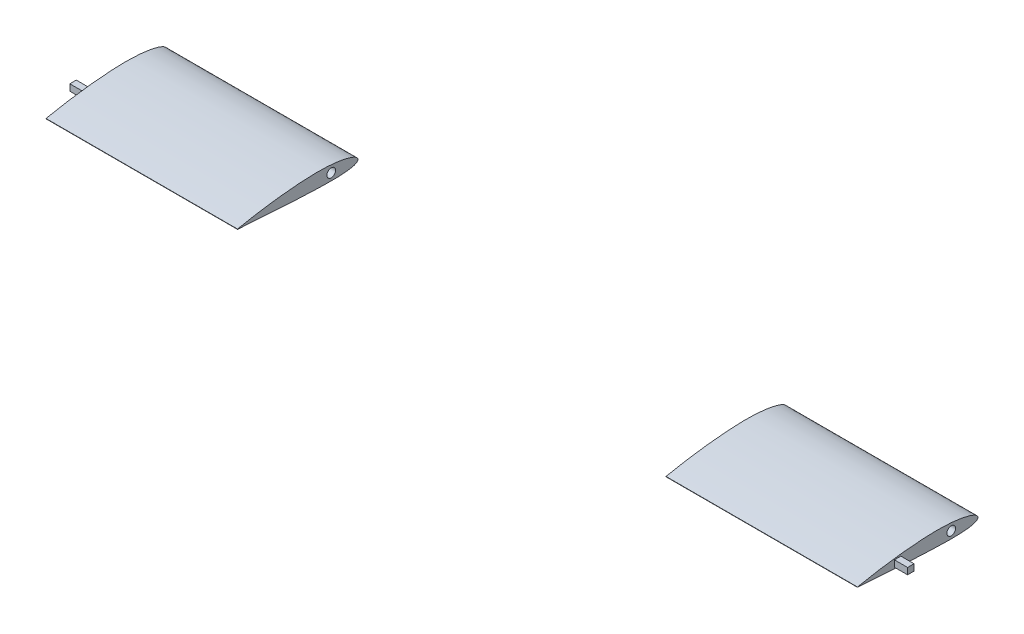
ISO-10303-21;
HEADER;
FILE_DESCRIPTION(('STEP AP214'),'2;1');
FILE_NAME('part.step','',(''),(''),'','','');
FILE_SCHEMA(('AUTOMOTIVE_DESIGN { 1 0 10303 214 1 1 1 1 }'));
ENDSEC;
DATA;
#1=APPLICATION_CONTEXT('core data for automotive mechanical design processes');
#2=APPLICATION_PROTOCOL_DEFINITION('international standard','automotive_design',2000,#1);
#3=PRODUCT_CONTEXT('',#1,'mechanical');
#4=PRODUCT('Part','Part','',(#3));
#5=PRODUCT_RELATED_PRODUCT_CATEGORY('part','',(#4));
#6=PRODUCT_DEFINITION_FORMATION('','',#4);
#7=PRODUCT_DEFINITION_CONTEXT('part definition',#1,'design');
#8=PRODUCT_DEFINITION('design','',#6,#7);
#9=PRODUCT_DEFINITION_SHAPE('','',#8);
#10=(LENGTH_UNIT() NAMED_UNIT(*) SI_UNIT(.MILLI.,.METRE.));
#11=(NAMED_UNIT(*) PLANE_ANGLE_UNIT() SI_UNIT($,.RADIAN.));
#12=(NAMED_UNIT(*) SI_UNIT($,.STERADIAN.) SOLID_ANGLE_UNIT());
#13=UNCERTAINTY_MEASURE_WITH_UNIT(LENGTH_MEASURE(1.E-05),#10,'distance_accuracy_value','');
#14=(GEOMETRIC_REPRESENTATION_CONTEXT(3) GLOBAL_UNCERTAINTY_ASSIGNED_CONTEXT((#13)) GLOBAL_UNIT_ASSIGNED_CONTEXT((#10,
#11,#12)) REPRESENTATION_CONTEXT('',''));
#15=CARTESIAN_POINT('',(0.,0.,0.));
#16=DIRECTION('',(0.,0.,1.));
#17=DIRECTION('',(1.,0.,0.));
#18=AXIS2_PLACEMENT_3D('',#15,#16,#17);
#19=CARTESIAN_POINT('',(383.,21.9066393458341,0.0898082584499967));
#20=DIRECTION('',(-1.,0.,0.));
#21=DIRECTION('',(0.,0.,-1.));
#22=AXIS2_PLACEMENT_3D('',#19,#20,#21);
#23=PLANE('',#22);
#24=CARTESIAN_POINT('',(383.,21.4323662432829,90.));
#25=CARTESIAN_POINT('',(383.,21.7395453735164,88.5009339259648));
#26=CARTESIAN_POINT('',(383.,22.3530968521773,85.5067389569377));
#27=CARTESIAN_POINT('',(383.,23.4769009739327,79.5132070250295));
#28=CARTESIAN_POINT('',(383.,24.7220768679953,72.0172549020665));
#29=CARTESIAN_POINT('',(383.,26.0108035511243,63.0161594976841));
#30=CARTESIAN_POINT('',(383.,27.0855539847585,54.0165489010127));
#31=CARTESIAN_POINT('',(383.,27.8725023386409,45.0130366232361));
#32=CARTESIAN_POINT('',(383.,28.4054210980569,36.0115747531414));
#33=CARTESIAN_POINT('',(383.,28.4956283216556,28.5013825090026));
#34=CARTESIAN_POINT('',(383.,28.2471424177953,22.4991480564598));
#35=CARTESIAN_POINT('',(383.,27.8830387632402,17.9937913398135));
#36=CARTESIAN_POINT('',(383.,27.3064569381922,13.4827466610456));
#37=CARTESIAN_POINT('',(383.,26.5964410206564,9.7284358411352));
#38=CARTESIAN_POINT('',(383.,25.7931618084987,6.73542557773655));
#39=CARTESIAN_POINT('',(383.,25.0628621788086,4.46630110284185));
#40=CARTESIAN_POINT('',(383.,24.2119534219819,2.543789770691));
#41=CARTESIAN_POINT('',(383.,23.1803206796216,0.88544887639786));
#42=CARTESIAN_POINT('',(383.,21.3962581054763,-0.560680660518415));
#43=CARTESIAN_POINT('',(383.,19.828099306194,0.941462623926129));
#44=CARTESIAN_POINT('',(383.,19.1128759355664,2.56878461221583));
#45=CARTESIAN_POINT('',(383.,18.5695879239883,4.48283790204994));
#46=CARTESIAN_POINT('',(383.,18.1800489520533,6.74449178966805));
#47=CARTESIAN_POINT('',(383.,17.8476208307239,9.74948066666687));
#48=CARTESIAN_POINT('',(383.,17.591755210336,13.5004363160743));
#49=CARTESIAN_POINT('',(383.,17.4891711460737,18.0043672362339));
#50=CARTESIAN_POINT('',(383.,17.503466580105,22.5050836996857));
#51=CARTESIAN_POINT('',(383.,17.6359103895328,28.5052315345405));
#52=CARTESIAN_POINT('',(383.,17.8742353776701,36.0061164796125));
#53=CARTESIAN_POINT('',(383.,18.2889930821133,45.0060655157111));
#54=CARTESIAN_POINT('',(383.,18.8280750549617,54.0034048422384));
#55=CARTESIAN_POINT('',(383.,19.3884076073586,63.002270200824));
#56=CARTESIAN_POINT('',(383.,19.9555851579576,72.0026742101379));
#57=CARTESIAN_POINT('',(383.,20.4779531958413,79.5005431049559));
#58=CARTESIAN_POINT('',(383.,20.88086522472,85.5006876811084));
#59=CARTESIAN_POINT('',(383.,21.0925383354339,88.5001605661209));
#60=CARTESIAN_POINT('',(383.,21.1983821589026,90.));
#61=B_SPLINE_CURVE_WITH_KNOTS('',3,(#24,#25,#26,#27,#28,#29,#30,#31,#32,#33,#34,#35,#36,#37,#38,
#39,#40,#41,#42,#43,#44,#45,#46,#47,#48,#49,#50,#51,#52,#53,#54,#55,#56,#57,#58,#59,#60),
.UNSPECIFIED.,.F.,.F.,(4,1,1,1,1,1,1,1,1,1,1,1,1,1,1,1,1,1,1,1,1,1,1,1,1,1,1,1,1,1,1,1,1,1,4),
(0.,0.0250124897498648,0.0499592861642578,0.0996729249269686,0.149206319909966,
0.198581096615965,0.247805170456833,0.296916574601493,0.345952721793533,0.370491625569911,
0.395091203654929,0.41981479582396,0.444798575016595,0.457489818915221,0.47040640543549,
0.483879408669829,0.491264120322896,0.503458853294665,0.513609129403887,0.520450990700287,
0.533235387615153,0.545691039147803,0.558031884237173,0.582609167247894,0.607134741746914,
0.631652079836766,0.656174271859652,0.705233949250519,0.754320378530032,0.803437363555032,
0.852566095729537,0.901700994033255,0.950848809337271,0.975422716989279,1.),.UNSPECIFIED.);
#62=CARTESIAN_POINT('',(383.,21.4323662432829,90.));
#63=VERTEX_POINT('',#62);
#64=CARTESIAN_POINT('',(383.,21.1983821589026,90.));
#65=VERTEX_POINT('',#64);
#66=EDGE_CURVE('E193',#63,#65,#61,.T.);
#67=ORIENTED_EDGE('',*,*,#66,.F.);
#68=DIRECTION('',(0.,1.,0.));
#69=VECTOR('',#68,1.);
#70=CARTESIAN_POINT('',(383.,21.4323662432829,90.));
#71=LINE('',#70,#69);
#72=EDGE_CURVE('E199',#65,#63,#71,.T.);
#73=ORIENTED_EDGE('',*,*,#72,.F.);
#74=EDGE_LOOP('',(#67,#73));
#75=FACE_BOUND('',#74,.T.);
#76=CARTESIAN_POINT('',(383.,22.7683278000442,20.));
#77=DIRECTION('',(1.,0.,0.));
#78=DIRECTION('',(0.,0.,-1.));
#79=AXIS2_PLACEMENT_3D('',#76,#77,#78);
#80=CIRCLE('',#79,3.25);
#81=CARTESIAN_POINT('',(383.,22.7683278000442,16.75));
#82=VERTEX_POINT('',#81);
#83=EDGE_CURVE('E160',#82,#82,#80,.T.);
#84=ORIENTED_EDGE('',*,*,#83,.F.);
#85=EDGE_LOOP('',(#84));
#86=FACE_BOUND('',#85,.T.);
#87=DIRECTION('',(0.,-1.,0.));
#88=VECTOR('',#87,1.);
#89=CARTESIAN_POINT('',(383.,20.3683278000442,57.6));
#90=LINE('',#89,#88);
#91=CARTESIAN_POINT('',(383.,25.1683278000442,57.6));
#92=VERTEX_POINT('',#91);
#93=CARTESIAN_POINT('',(383.,20.3683278000442,57.6));
#94=VERTEX_POINT('',#93);
#95=EDGE_CURVE('E151',#92,#94,#90,.T.);
#96=ORIENTED_EDGE('',*,*,#95,.T.);
#97=DIRECTION('',(0.,0.,1.));
#98=VECTOR('',#97,1.);
#99=CARTESIAN_POINT('',(383.,20.3683278000442,62.4));
#100=LINE('',#99,#98);
#101=CARTESIAN_POINT('',(383.,20.3683278000442,62.4));
#102=VERTEX_POINT('',#101);
#103=EDGE_CURVE('E137',#94,#102,#100,.T.);
#104=ORIENTED_EDGE('',*,*,#103,.T.);
#105=DIRECTION('',(0.,1.,0.));
#106=VECTOR('',#105,1.);
#107=CARTESIAN_POINT('',(383.,25.1683278000442,62.4));
#108=LINE('',#107,#106);
#109=CARTESIAN_POINT('',(383.,25.1683278000442,62.4));
#110=VERTEX_POINT('',#109);
#111=EDGE_CURVE('E145',#102,#110,#108,.T.);
#112=ORIENTED_EDGE('',*,*,#111,.T.);
#113=DIRECTION('',(0.,0.,-1.));
#114=VECTOR('',#113,1.);
#115=CARTESIAN_POINT('',(383.,25.1683278000442,57.6));
#116=LINE('',#115,#114);
#117=EDGE_CURVE('E142',#110,#92,#116,.T.);
#118=ORIENTED_EDGE('',*,*,#117,.T.);
#119=EDGE_LOOP('',(#96,#104,#112,#118));
#120=FACE_BOUND('',#119,.T.);
#121=ADVANCED_FACE('F73',(#75,#86,#120),#23,.F.);
#122=CARTESIAN_POINT('',(160.,0.,90.));
#123=DIRECTION('',(0.,0.,1.));
#124=DIRECTION('',(-1.,0.,0.));
#125=AXIS2_PLACEMENT_3D('',#122,#123,#124);
#126=PLANE('',#125);
#127=DIRECTION('',(0.,-1.,0.));
#128=VECTOR('',#127,1.);
#129=CARTESIAN_POINT('',(240.,0.,90.));
#130=LINE('',#129,#128);
#131=CARTESIAN_POINT('',(240.,21.4323662432829,90.));
#132=VERTEX_POINT('',#131);
#133=CARTESIAN_POINT('',(240.,21.1983821589026,90.));
#134=VERTEX_POINT('',#133);
#135=EDGE_CURVE('E163',#132,#134,#130,.T.);
#136=ORIENTED_EDGE('',*,*,#135,.T.);
#137=DIRECTION('',(-1.,0.,0.));
#138=VECTOR('',#137,1.);
#139=CARTESIAN_POINT('',(383.,21.1983821589026,90.));
#140=LINE('',#139,#138);
#141=EDGE_CURVE('E82',#65,#134,#140,.T.);
#142=ORIENTED_EDGE('',*,*,#141,.F.);
#143=ORIENTED_EDGE('',*,*,#72,.T.);
#144=DIRECTION('',(-1.,0.,0.));
#145=VECTOR('',#144,1.);
#146=CARTESIAN_POINT('',(383.,21.4323662432829,90.));
#147=LINE('',#146,#145);
#148=EDGE_CURVE('E206',#63,#132,#147,.T.);
#149=ORIENTED_EDGE('',*,*,#148,.T.);
#150=EDGE_LOOP('',(#136,#142,#143,#149));
#151=FACE_BOUND('',#150,.T.);
#152=ADVANCED_FACE('F75',(#151),#126,.T.);
#153=DIRECTION('',(-1.,0.,0.));
#154=VECTOR('',#153,1.);
#155=SURFACE_OF_LINEAR_EXTRUSION('',#61,#154);
#156=CARTESIAN_POINT('',(240.,21.1983821589026,90.));
#157=CARTESIAN_POINT('',(240.,21.0925383354339,88.5001605661209));
#158=CARTESIAN_POINT('',(240.,20.88086522472,85.5006876811084));
#159=CARTESIAN_POINT('',(240.,20.4779531958413,79.5005431049559));
#160=CARTESIAN_POINT('',(240.,19.9555851579576,72.0026742101379));
#161=CARTESIAN_POINT('',(240.,19.3884076073586,63.002270200824));
#162=CARTESIAN_POINT('',(240.,18.8280750549617,54.0034048422384));
#163=CARTESIAN_POINT('',(240.,18.2889930821133,45.0060655157111));
#164=CARTESIAN_POINT('',(240.,17.8742353776701,36.0061164796125));
#165=CARTESIAN_POINT('',(240.,17.6359103895328,28.5052315345405));
#166=CARTESIAN_POINT('',(240.,17.503466580105,22.5050836996857));
#167=CARTESIAN_POINT('',(240.,17.4891711460737,18.0043672362339));
#168=CARTESIAN_POINT('',(240.,17.591755210336,13.5004363160743));
#169=CARTESIAN_POINT('',(240.,17.8476208307239,9.74948066666687));
#170=CARTESIAN_POINT('',(240.,18.1800489520533,6.74449178966805));
#171=CARTESIAN_POINT('',(240.,18.5695879239883,4.48283790204994));
#172=CARTESIAN_POINT('',(240.,19.1128759355664,2.56878461221583));
#173=CARTESIAN_POINT('',(240.,19.828099306194,0.941462623926129));
#174=CARTESIAN_POINT('',(240.,21.3962581054763,-0.560680660518415));
#175=CARTESIAN_POINT('',(240.,23.1803206796216,0.88544887639786));
#176=CARTESIAN_POINT('',(240.,24.2119534219819,2.543789770691));
#177=CARTESIAN_POINT('',(240.,25.0628621788086,4.46630110284185));
#178=CARTESIAN_POINT('',(240.,25.7931618084987,6.73542557773655));
#179=CARTESIAN_POINT('',(240.,26.5964410206564,9.7284358411352));
#180=CARTESIAN_POINT('',(240.,27.3064569381922,13.4827466610456));
#181=CARTESIAN_POINT('',(240.,27.8830387632402,17.9937913398135));
#182=CARTESIAN_POINT('',(240.,28.2471424177953,22.4991480564598));
#183=CARTESIAN_POINT('',(240.,28.4956283216556,28.5013825090026));
#184=CARTESIAN_POINT('',(240.,28.4054210980569,36.0115747531414));
#185=CARTESIAN_POINT('',(240.,27.8725023386409,45.0130366232361));
#186=CARTESIAN_POINT('',(240.,27.0855539847585,54.0165489010127));
#187=CARTESIAN_POINT('',(240.,26.0108035511243,63.0161594976841));
#188=CARTESIAN_POINT('',(240.,24.7220768679953,72.0172549020665));
#189=CARTESIAN_POINT('',(240.,23.4769009739327,79.5132070250295));
#190=CARTESIAN_POINT('',(240.,22.3530968521773,85.5067389569377));
#191=CARTESIAN_POINT('',(240.,21.7395453735164,88.5009339259648));
#192=CARTESIAN_POINT('',(240.,21.4323662432829,90.));
#193=B_SPLINE_CURVE_WITH_KNOTS('',3,(#156,#157,#158,#159,#160,#161,#162,#163,#164,#165,#166,
#167,#168,#169,#170,#171,#172,#173,#174,#175,#176,#177,#178,#179,#180,#181,#182,#183,#184,#185,
#186,#187,#188,#189,#190,#191,#192),.UNSPECIFIED.,.F.,.F.,(4,1,1,1,1,1,1,1,1,1,1,1,1,1,1,1,1,1,
1,1,1,1,1,1,1,1,1,1,1,1,1,1,1,1,4),(0.,0.0245772830107215,0.0491511906627294,0.0982990059667455,
0.147433904270463,0.196562636444968,0.245679621469968,0.294766050749481,0.343825728140348,
0.368347920163234,0.392865258253086,0.417390832752106,0.441968115762827,0.454308960852197,
0.466764612384847,0.479549009299713,0.486390870596113,0.496541146705335,0.508735879677104,
0.516120591330171,0.52959359456451,0.542510181084779,0.555201424983405,0.58018520417604,
0.604908796345071,0.629508374430089,0.654047278206467,0.703083425398507,0.752194829543167,
0.801418903384035,0.850793680090034,0.900327075073031,0.950040713835742,0.974987510250135,1.),.UNSPECIFIED.);
#194=EDGE_CURVE('E13',#134,#132,#193,.T.);
#195=ORIENTED_EDGE('',*,*,#194,.T.);
#196=ORIENTED_EDGE('',*,*,#148,.F.);
#197=ORIENTED_EDGE('',*,*,#66,.T.);
#198=ORIENTED_EDGE('',*,*,#141,.T.);
#199=EDGE_LOOP('',(#195,#196,#197,#198));
#200=FACE_BOUND('',#199,.T.);
#201=ADVANCED_FACE('F184',(#200),#155,.T.);
#202=CARTESIAN_POINT('',(240.,0.,0.));
#203=DIRECTION('',(1.,0.,0.));
#204=DIRECTION('',(0.,0.,1.));
#205=AXIS2_PLACEMENT_3D('',#202,#203,#204);
#206=PLANE('',#205);
#207=CARTESIAN_POINT('',(240.,22.7683278000442,20.));
#208=DIRECTION('',(-1.,0.,0.));
#209=DIRECTION('',(0.,0.,1.));
#210=AXIS2_PLACEMENT_3D('',#207,#208,#209);
#211=CIRCLE('',#210,3.25);
#212=CARTESIAN_POINT('',(240.,22.7683278000442,23.25));
#213=VERTEX_POINT('',#212);
#214=EDGE_CURVE('E77',#213,#213,#211,.T.);
#215=ORIENTED_EDGE('',*,*,#214,.F.);
#216=EDGE_LOOP('',(#215));
#217=FACE_BOUND('',#216,.T.);
#218=ORIENTED_EDGE('',*,*,#135,.F.);
#219=ORIENTED_EDGE('',*,*,#194,.F.);
#220=EDGE_LOOP('',(#218,#219));
#221=FACE_BOUND('',#220,.T.);
#222=ADVANCED_FACE('F173',(#217,#221),#206,.F.);
#223=CARTESIAN_POINT('',(239.974958566065,22.7683278000442,20.));
#224=DIRECTION('',(1.,0.,0.));
#225=DIRECTION('',(0.,0.,1.));
#226=AXIS2_PLACEMENT_3D('',#223,#224,#225);
#227=CYLINDRICAL_SURFACE('',#226,3.25);
#228=ORIENTED_EDGE('',*,*,#214,.T.);
#229=EDGE_LOOP('',(#228));
#230=FACE_BOUND('',#229,.T.);
#231=ORIENTED_EDGE('',*,*,#83,.T.);
#232=EDGE_LOOP('',(#231));
#233=FACE_BOUND('',#232,.T.);
#234=ADVANCED_FACE('F183',(#230,#233),#227,.F.);
#235=CARTESIAN_POINT('',(392.8,20.3683278000442,57.6));
#236=DIRECTION('',(0.,0.,1.));
#237=DIRECTION('',(-1.,0.,0.));
#238=AXIS2_PLACEMENT_3D('',#235,#236,#237);
#239=PLANE('',#238);
#240=ORIENTED_EDGE('',*,*,#95,.F.);
#241=DIRECTION('',(-1.,0.,0.));
#242=VECTOR('',#241,1.);
#243=CARTESIAN_POINT('',(392.8,25.1683278000442,57.6));
#244=LINE('',#243,#242);
#245=CARTESIAN_POINT('',(392.8,25.1683278000442,57.6));
#246=VERTEX_POINT('',#245);
#247=EDGE_CURVE('E141',#246,#92,#244,.T.);
#248=ORIENTED_EDGE('',*,*,#247,.F.);
#249=DIRECTION('',(0.,-1.,0.));
#250=VECTOR('',#249,1.);
#251=CARTESIAN_POINT('',(392.8,20.3683278000442,57.6));
#252=LINE('',#251,#250);
#253=CARTESIAN_POINT('',(392.8,20.3683278000442,57.6));
#254=VERTEX_POINT('',#253);
#255=EDGE_CURVE('E130',#246,#254,#252,.T.);
#256=ORIENTED_EDGE('',*,*,#255,.T.);
#257=DIRECTION('',(-1.,0.,0.));
#258=VECTOR('',#257,1.);
#259=CARTESIAN_POINT('',(392.8,20.3683278000442,57.6));
#260=LINE('',#259,#258);
#261=EDGE_CURVE('E89',#254,#94,#260,.T.);
#262=ORIENTED_EDGE('',*,*,#261,.T.);
#263=EDGE_LOOP('',(#240,#248,#256,#262));
#264=FACE_BOUND('',#263,.T.);
#265=ADVANCED_FACE('F140',(#264),#239,.F.);
#266=CARTESIAN_POINT('',(392.8,20.3683278000442,62.4));
#267=DIRECTION('',(0.,1.,0.));
#268=DIRECTION('',(0.,0.,1.));
#269=AXIS2_PLACEMENT_3D('',#266,#267,#268);
#270=PLANE('',#269);
#271=ORIENTED_EDGE('',*,*,#103,.F.);
#272=ORIENTED_EDGE('',*,*,#261,.F.);
#273=DIRECTION('',(0.,0.,1.));
#274=VECTOR('',#273,1.);
#275=CARTESIAN_POINT('',(392.8,20.3683278000442,62.4));
#276=LINE('',#275,#274);
#277=CARTESIAN_POINT('',(392.8,20.3683278000442,62.4));
#278=VERTEX_POINT('',#277);
#279=EDGE_CURVE('E128',#254,#278,#276,.T.);
#280=ORIENTED_EDGE('',*,*,#279,.T.);
#281=DIRECTION('',(-1.,0.,0.));
#282=VECTOR('',#281,1.);
#283=CARTESIAN_POINT('',(392.8,20.3683278000442,62.4));
#284=LINE('',#283,#282);
#285=EDGE_CURVE('E96',#278,#102,#284,.T.);
#286=ORIENTED_EDGE('',*,*,#285,.T.);
#287=EDGE_LOOP('',(#271,#272,#280,#286));
#288=FACE_BOUND('',#287,.T.);
#289=ADVANCED_FACE('F135',(#288),#270,.F.);
#290=CARTESIAN_POINT('',(392.8,25.1683278000442,62.4));
#291=DIRECTION('',(0.,0.,-1.));
#292=DIRECTION('',(1.,0.,0.));
#293=AXIS2_PLACEMENT_3D('',#290,#291,#292);
#294=PLANE('',#293);
#295=ORIENTED_EDGE('',*,*,#111,.F.);
#296=ORIENTED_EDGE('',*,*,#285,.F.);
#297=DIRECTION('',(0.,1.,0.));
#298=VECTOR('',#297,1.);
#299=CARTESIAN_POINT('',(392.8,25.1683278000442,62.4));
#300=LINE('',#299,#298);
#301=CARTESIAN_POINT('',(392.8,25.1683278000442,62.4));
#302=VERTEX_POINT('',#301);
#303=EDGE_CURVE('E133',#278,#302,#300,.T.);
#304=ORIENTED_EDGE('',*,*,#303,.T.);
#305=DIRECTION('',(-1.,0.,0.));
#306=VECTOR('',#305,1.);
#307=CARTESIAN_POINT('',(392.8,25.1683278000442,62.4));
#308=LINE('',#307,#306);
#309=EDGE_CURVE('E157',#302,#110,#308,.T.);
#310=ORIENTED_EDGE('',*,*,#309,.T.);
#311=EDGE_LOOP('',(#295,#296,#304,#310));
#312=FACE_BOUND('',#311,.T.);
#313=ADVANCED_FACE('F233',(#312),#294,.F.);
#314=CARTESIAN_POINT('',(392.8,25.1683278000442,57.6));
#315=DIRECTION('',(0.,-1.,0.));
#316=DIRECTION('',(0.,0.,-1.));
#317=AXIS2_PLACEMENT_3D('',#314,#315,#316);
#318=PLANE('',#317);
#319=ORIENTED_EDGE('',*,*,#117,.F.);
#320=ORIENTED_EDGE('',*,*,#309,.F.);
#321=DIRECTION('',(0.,0.,-1.));
#322=VECTOR('',#321,1.);
#323=CARTESIAN_POINT('',(392.8,25.1683278000442,57.6));
#324=LINE('',#323,#322);
#325=EDGE_CURVE('E149',#302,#246,#324,.T.);
#326=ORIENTED_EDGE('',*,*,#325,.T.);
#327=ORIENTED_EDGE('',*,*,#247,.T.);
#328=EDGE_LOOP('',(#319,#320,#326,#327));
#329=FACE_BOUND('',#328,.T.);
#330=ADVANCED_FACE('F231',(#329),#318,.F.);
#331=CARTESIAN_POINT('',(392.8,0.,0.));
#332=DIRECTION('',(-1.,0.,0.));
#333=DIRECTION('',(0.,0.,-1.));
#334=AXIS2_PLACEMENT_3D('',#331,#332,#333);
#335=PLANE('',#334);
#336=ORIENTED_EDGE('',*,*,#255,.F.);
#337=ORIENTED_EDGE('',*,*,#325,.F.);
#338=ORIENTED_EDGE('',*,*,#303,.F.);
#339=ORIENTED_EDGE('',*,*,#279,.F.);
#340=EDGE_LOOP('',(#336,#337,#338,#339));
#341=FACE_BOUND('',#340,.T.);
#342=ADVANCED_FACE('F129',(#341),#335,.F.);
#343=CLOSED_SHELL('',(#121,#152,#201,#222,#234,#265,#289,#313,#330,#342));
#344=MANIFOLD_SOLID_BREP('B2',#343);
#345=CARTESIAN_POINT('',(-223.,21.9066393458341,0.0898082584499967));
#346=DIRECTION('',(1.,0.,0.));
#347=DIRECTION('',(0.,0.,-1.));
#348=AXIS2_PLACEMENT_3D('',#345,#346,#347);
#349=PLANE('',#348);
#350=CARTESIAN_POINT('',(-223.,21.4323662432829,90.));
#351=CARTESIAN_POINT('',(-223.,21.7395453735164,88.5009339259648));
#352=CARTESIAN_POINT('',(-223.,22.3530968521773,85.5067389569377));
#353=CARTESIAN_POINT('',(-223.,23.4769009739327,79.5132070250295));
#354=CARTESIAN_POINT('',(-223.,24.7220768679953,72.0172549020665));
#355=CARTESIAN_POINT('',(-223.,26.0108035511243,63.0161594976841));
#356=CARTESIAN_POINT('',(-223.,27.0855539847585,54.0165489010127));
#357=CARTESIAN_POINT('',(-223.,27.8725023386409,45.0130366232361));
#358=CARTESIAN_POINT('',(-223.,28.4054210980569,36.0115747531414));
#359=CARTESIAN_POINT('',(-223.,28.4956283216556,28.5013825090026));
#360=CARTESIAN_POINT('',(-223.,28.2471424177953,22.4991480564598));
#361=CARTESIAN_POINT('',(-223.,27.8830387632402,17.9937913398135));
#362=CARTESIAN_POINT('',(-223.,27.3064569381922,13.4827466610456));
#363=CARTESIAN_POINT('',(-223.,26.5964410206564,9.7284358411352));
#364=CARTESIAN_POINT('',(-223.,25.7931618084987,6.73542557773655));
#365=CARTESIAN_POINT('',(-223.,25.0628621788086,4.46630110284185));
#366=CARTESIAN_POINT('',(-223.,24.2119534219819,2.543789770691));
#367=CARTESIAN_POINT('',(-223.,23.1803206796216,0.88544887639786));
#368=CARTESIAN_POINT('',(-223.,21.3962581054763,-0.560680660518415));
#369=CARTESIAN_POINT('',(-223.,19.828099306194,0.941462623926129));
#370=CARTESIAN_POINT('',(-223.,19.1128759355664,2.56878461221583));
#371=CARTESIAN_POINT('',(-223.,18.5695879239883,4.48283790204994));
#372=CARTESIAN_POINT('',(-223.,18.1800489520533,6.74449178966805));
#373=CARTESIAN_POINT('',(-223.,17.8476208307239,9.74948066666687));
#374=CARTESIAN_POINT('',(-223.,17.591755210336,13.5004363160743));
#375=CARTESIAN_POINT('',(-223.,17.4891711460737,18.0043672362339));
#376=CARTESIAN_POINT('',(-223.,17.503466580105,22.5050836996857));
#377=CARTESIAN_POINT('',(-223.,17.6359103895328,28.5052315345405));
#378=CARTESIAN_POINT('',(-223.,17.8742353776701,36.0061164796125));
#379=CARTESIAN_POINT('',(-223.,18.2889930821133,45.0060655157111));
#380=CARTESIAN_POINT('',(-223.,18.8280750549617,54.0034048422384));
#381=CARTESIAN_POINT('',(-223.,19.3884076073586,63.002270200824));
#382=CARTESIAN_POINT('',(-223.,19.9555851579576,72.0026742101379));
#383=CARTESIAN_POINT('',(-223.,20.4779531958413,79.5005431049559));
#384=CARTESIAN_POINT('',(-223.,20.88086522472,85.5006876811084));
#385=CARTESIAN_POINT('',(-223.,21.0925383354339,88.5001605661209));
#386=CARTESIAN_POINT('',(-223.,21.1983821589026,90.));
#387=B_SPLINE_CURVE_WITH_KNOTS('',3,(#350,#351,#352,#353,#354,#355,#356,#357,#358,#359,#360,
#361,#362,#363,#364,#365,#366,#367,#368,#369,#370,#371,#372,#373,#374,#375,#376,#377,#378,#379,
#380,#381,#382,#383,#384,#385,#386),.UNSPECIFIED.,.F.,.F.,(4,1,1,1,1,1,1,1,1,1,1,1,1,1,1,1,1,1,
1,1,1,1,1,1,1,1,1,1,1,1,1,1,1,1,4),(0.,0.0250124897498648,0.0499592861642578,0.0996729249269686,
0.149206319909966,0.198581096615965,0.247805170456833,0.296916574601493,0.345952721793533,
0.370491625569911,0.395091203654929,0.41981479582396,0.444798575016595,0.457489818915221,
0.47040640543549,0.483879408669829,0.491264120322896,0.503458853294665,0.513609129403887,
0.520450990700287,0.533235387615153,0.545691039147803,0.558031884237173,0.582609167247894,
0.607134741746914,0.631652079836766,0.656174271859652,0.705233949250519,0.754320378530032,
0.803437363555032,0.852566095729537,0.901700994033255,0.950848809337271,0.975422716989279,1.),.UNSPECIFIED.);
#388=CARTESIAN_POINT('',(-223.,21.4323662432829,90.));
#389=VERTEX_POINT('',#388);
#390=CARTESIAN_POINT('',(-223.,21.1983821589026,90.));
#391=VERTEX_POINT('',#390);
#392=EDGE_CURVE('E452',#389,#391,#387,.T.);
#393=ORIENTED_EDGE('',*,*,#392,.T.);
#394=DIRECTION('',(0.,1.,0.));
#395=VECTOR('',#394,1.);
#396=CARTESIAN_POINT('',(-223.,21.4323662432829,90.));
#397=LINE('',#396,#395);
#398=EDGE_CURVE('E458',#391,#389,#397,.T.);
#399=ORIENTED_EDGE('',*,*,#398,.T.);
#400=EDGE_LOOP('',(#393,#399));
#401=FACE_BOUND('',#400,.T.);
#402=CARTESIAN_POINT('',(-223.,22.7683278000442,20.));
#403=DIRECTION('',(1.,0.,0.));
#404=DIRECTION('',(0.,0.,-1.));
#405=AXIS2_PLACEMENT_3D('',#402,#403,#404);
#406=CIRCLE('',#405,3.25);
#407=CARTESIAN_POINT('',(-223.,22.7683278000442,16.75));
#408=VERTEX_POINT('',#407);
#409=EDGE_CURVE('E414',#408,#408,#406,.T.);
#410=ORIENTED_EDGE('',*,*,#409,.T.);
#411=EDGE_LOOP('',(#410));
#412=FACE_BOUND('',#411,.T.);
#413=DIRECTION('',(0.,-1.,0.));
#414=VECTOR('',#413,1.);
#415=CARTESIAN_POINT('',(-223.,20.3683278000442,57.6));
#416=LINE('',#415,#414);
#417=CARTESIAN_POINT('',(-223.,25.1683278000442,57.6));
#418=VERTEX_POINT('',#417);
#419=CARTESIAN_POINT('',(-223.,20.3683278000442,57.6));
#420=VERTEX_POINT('',#419);
#421=EDGE_CURVE('E411',#418,#420,#416,.T.);
#422=ORIENTED_EDGE('',*,*,#421,.F.);
#423=DIRECTION('',(0.,0.,-1.));
#424=VECTOR('',#423,1.);
#425=CARTESIAN_POINT('',(-223.,25.1683278000442,57.6));
#426=LINE('',#425,#424);
#427=CARTESIAN_POINT('',(-223.,25.1683278000442,62.4));
#428=VERTEX_POINT('',#427);
#429=EDGE_CURVE('E408',#428,#418,#426,.T.);
#430=ORIENTED_EDGE('',*,*,#429,.F.);
#431=DIRECTION('',(0.,1.,0.));
#432=VECTOR('',#431,1.);
#433=CARTESIAN_POINT('',(-223.,25.1683278000442,62.4));
#434=LINE('',#433,#432);
#435=CARTESIAN_POINT('',(-223.,20.3683278000442,62.4));
#436=VERTEX_POINT('',#435);
#437=EDGE_CURVE('E359',#436,#428,#434,.T.);
#438=ORIENTED_EDGE('',*,*,#437,.F.);
#439=DIRECTION('',(0.,0.,1.));
#440=VECTOR('',#439,1.);
#441=CARTESIAN_POINT('',(-223.,20.3683278000442,62.4));
#442=LINE('',#441,#440);
#443=EDGE_CURVE('E354',#420,#436,#442,.T.);
#444=ORIENTED_EDGE('',*,*,#443,.F.);
#445=EDGE_LOOP('',(#422,#430,#438,#444));
#446=FACE_BOUND('',#445,.T.);
#447=ADVANCED_FACE('F338',(#401,#412,#446),#349,.F.);
#448=CARTESIAN_POINT('',(0.,0.,90.));
#449=DIRECTION('',(0.,0.,1.));
#450=DIRECTION('',(1.,0.,0.));
#451=AXIS2_PLACEMENT_3D('',#448,#449,#450);
#452=PLANE('',#451);
#453=DIRECTION('',(0.,-1.,0.));
#454=VECTOR('',#453,1.);
#455=CARTESIAN_POINT('',(-80.,0.,90.));
#456=LINE('',#455,#454);
#457=CARTESIAN_POINT('',(-80.,21.4323662432829,90.));
#458=VERTEX_POINT('',#457);
#459=CARTESIAN_POINT('',(-80.,21.1983821589026,90.));
#460=VERTEX_POINT('',#459);
#461=EDGE_CURVE('E421',#458,#460,#456,.T.);
#462=ORIENTED_EDGE('',*,*,#461,.F.);
#463=DIRECTION('',(1.,0.,0.));
#464=VECTOR('',#463,1.);
#465=CARTESIAN_POINT('',(-223.,21.4323662432829,90.));
#466=LINE('',#465,#464);
#467=EDGE_CURVE('E464',#389,#458,#466,.T.);
#468=ORIENTED_EDGE('',*,*,#467,.F.);
#469=ORIENTED_EDGE('',*,*,#398,.F.);
#470=DIRECTION('',(1.,0.,0.));
#471=VECTOR('',#470,1.);
#472=CARTESIAN_POINT('',(-223.,21.1983821589026,90.));
#473=LINE('',#472,#471);
#474=EDGE_CURVE('E347',#391,#460,#473,.T.);
#475=ORIENTED_EDGE('',*,*,#474,.T.);
#476=EDGE_LOOP('',(#462,#468,#469,#475));
#477=FACE_BOUND('',#476,.T.);
#478=ADVANCED_FACE('F340',(#477),#452,.T.);
#479=DIRECTION('',(1.,0.,0.));
#480=VECTOR('',#479,1.);
#481=SURFACE_OF_LINEAR_EXTRUSION('',#387,#480);
#482=CARTESIAN_POINT('',(-80.,21.1983821589026,90.));
#483=CARTESIAN_POINT('',(-80.,21.0925383354339,88.5001605661209));
#484=CARTESIAN_POINT('',(-80.,20.88086522472,85.5006876811084));
#485=CARTESIAN_POINT('',(-80.,20.4779531958413,79.5005431049559));
#486=CARTESIAN_POINT('',(-80.,19.9555851579576,72.0026742101379));
#487=CARTESIAN_POINT('',(-80.,19.3884076073586,63.002270200824));
#488=CARTESIAN_POINT('',(-80.,18.8280750549617,54.0034048422384));
#489=CARTESIAN_POINT('',(-80.,18.2889930821133,45.0060655157111));
#490=CARTESIAN_POINT('',(-80.,17.8742353776701,36.0061164796125));
#491=CARTESIAN_POINT('',(-80.,17.6359103895328,28.5052315345405));
#492=CARTESIAN_POINT('',(-80.,17.503466580105,22.5050836996857));
#493=CARTESIAN_POINT('',(-80.,17.4891711460737,18.0043672362339));
#494=CARTESIAN_POINT('',(-80.,17.591755210336,13.5004363160743));
#495=CARTESIAN_POINT('',(-80.,17.8476208307239,9.74948066666687));
#496=CARTESIAN_POINT('',(-80.,18.1800489520533,6.74449178966805));
#497=CARTESIAN_POINT('',(-80.,18.5695879239883,4.48283790204994));
#498=CARTESIAN_POINT('',(-80.,19.1128759355664,2.56878461221583));
#499=CARTESIAN_POINT('',(-80.,19.828099306194,0.941462623926129));
#500=CARTESIAN_POINT('',(-80.,21.3962581054763,-0.560680660518415));
#501=CARTESIAN_POINT('',(-80.,23.1803206796216,0.88544887639786));
#502=CARTESIAN_POINT('',(-80.,24.2119534219819,2.543789770691));
#503=CARTESIAN_POINT('',(-80.,25.0628621788086,4.46630110284185));
#504=CARTESIAN_POINT('',(-80.,25.7931618084987,6.73542557773655));
#505=CARTESIAN_POINT('',(-80.,26.5964410206564,9.7284358411352));
#506=CARTESIAN_POINT('',(-80.,27.3064569381922,13.4827466610456));
#507=CARTESIAN_POINT('',(-80.,27.8830387632402,17.9937913398135));
#508=CARTESIAN_POINT('',(-80.,28.2471424177953,22.4991480564598));
#509=CARTESIAN_POINT('',(-80.,28.4956283216556,28.5013825090026));
#510=CARTESIAN_POINT('',(-80.,28.4054210980569,36.0115747531414));
#511=CARTESIAN_POINT('',(-80.,27.8725023386409,45.0130366232361));
#512=CARTESIAN_POINT('',(-80.,27.0855539847585,54.0165489010127));
#513=CARTESIAN_POINT('',(-80.,26.0108035511243,63.0161594976841));
#514=CARTESIAN_POINT('',(-80.,24.7220768679953,72.0172549020665));
#515=CARTESIAN_POINT('',(-80.,23.4769009739327,79.5132070250295));
#516=CARTESIAN_POINT('',(-80.,22.3530968521773,85.5067389569377));
#517=CARTESIAN_POINT('',(-80.,21.7395453735164,88.5009339259648));
#518=CARTESIAN_POINT('',(-80.,21.4323662432829,90.));
#519=B_SPLINE_CURVE_WITH_KNOTS('',3,(#482,#483,#484,#485,#486,#487,#488,#489,#490,#491,#492,
#493,#494,#495,#496,#497,#498,#499,#500,#501,#502,#503,#504,#505,#506,#507,#508,#509,#510,#511,
#512,#513,#514,#515,#516,#517,#518),.UNSPECIFIED.,.F.,.F.,(4,1,1,1,1,1,1,1,1,1,1,1,1,1,1,1,1,1,
1,1,1,1,1,1,1,1,1,1,1,1,1,1,1,1,4),(0.,0.0245772830107215,0.0491511906627294,0.0982990059667455,
0.147433904270463,0.196562636444968,0.245679621469968,0.294766050749481,0.343825728140348,
0.368347920163234,0.392865258253086,0.417390832752106,0.441968115762827,0.454308960852197,
0.466764612384847,0.479549009299713,0.486390870596113,0.496541146705335,0.508735879677104,
0.516120591330171,0.52959359456451,0.542510181084779,0.555201424983405,0.58018520417604,
0.604908796345071,0.629508374430089,0.654047278206467,0.703083425398507,0.752194829543167,
0.801418903384035,0.850793680090034,0.900327075073031,0.950040713835742,0.974987510250135,1.),.UNSPECIFIED.);
#520=EDGE_CURVE('E71',#460,#458,#519,.T.);
#521=ORIENTED_EDGE('',*,*,#520,.F.);
#522=ORIENTED_EDGE('',*,*,#474,.F.);
#523=ORIENTED_EDGE('',*,*,#392,.F.);
#524=ORIENTED_EDGE('',*,*,#467,.T.);
#525=EDGE_LOOP('',(#521,#522,#523,#524));
#526=FACE_BOUND('',#525,.T.);
#527=ADVANCED_FACE('F442',(#526),#481,.F.);
#528=CARTESIAN_POINT('',(-80.,0.,0.));
#529=DIRECTION('',(-1.,0.,0.));
#530=DIRECTION('',(0.,0.,1.));
#531=AXIS2_PLACEMENT_3D('',#528,#529,#530);
#532=PLANE('',#531);
#533=CARTESIAN_POINT('',(-80.,22.7683278000442,20.));
#534=DIRECTION('',(-1.,0.,0.));
#535=DIRECTION('',(0.,0.,1.));
#536=AXIS2_PLACEMENT_3D('',#533,#534,#535);
#537=CIRCLE('',#536,3.25);
#538=CARTESIAN_POINT('',(-80.,22.7683278000442,23.25));
#539=VERTEX_POINT('',#538);
#540=EDGE_CURVE('E342',#539,#539,#537,.T.);
#541=ORIENTED_EDGE('',*,*,#540,.T.);
#542=EDGE_LOOP('',(#541));
#543=FACE_BOUND('',#542,.T.);
#544=ORIENTED_EDGE('',*,*,#461,.T.);
#545=ORIENTED_EDGE('',*,*,#520,.T.);
#546=EDGE_LOOP('',(#544,#545));
#547=FACE_BOUND('',#546,.T.);
#548=ADVANCED_FACE('F431',(#543,#547),#532,.F.);
#549=CARTESIAN_POINT('',(-79.9749585660652,22.7683278000442,20.));
#550=DIRECTION('',(-1.,0.,0.));
#551=DIRECTION('',(0.,0.,1.));
#552=AXIS2_PLACEMENT_3D('',#549,#550,#551);
#553=CYLINDRICAL_SURFACE('',#552,3.25);
#554=ORIENTED_EDGE('',*,*,#540,.F.);
#555=EDGE_LOOP('',(#554));
#556=FACE_BOUND('',#555,.T.);
#557=ORIENTED_EDGE('',*,*,#409,.F.);
#558=EDGE_LOOP('',(#557));
#559=FACE_BOUND('',#558,.T.);
#560=ADVANCED_FACE('F441',(#556,#559),#553,.F.);
#561=CARTESIAN_POINT('',(-232.8,20.3683278000442,57.6));
#562=DIRECTION('',(0.,0.,1.));
#563=DIRECTION('',(1.,0.,0.));
#564=AXIS2_PLACEMENT_3D('',#561,#562,#563);
#565=PLANE('',#564);
#566=ORIENTED_EDGE('',*,*,#421,.T.);
#567=DIRECTION('',(1.,0.,0.));
#568=VECTOR('',#567,1.);
#569=CARTESIAN_POINT('',(-232.8,20.3683278000442,57.6));
#570=LINE('',#569,#568);
#571=CARTESIAN_POINT('',(-232.8,20.3683278000442,57.6));
#572=VERTEX_POINT('',#571);
#573=EDGE_CURVE('E392',#572,#420,#570,.T.);
#574=ORIENTED_EDGE('',*,*,#573,.F.);
#575=DIRECTION('',(0.,-1.,0.));
#576=VECTOR('',#575,1.);
#577=CARTESIAN_POINT('',(-232.8,20.3683278000442,57.6));
#578=LINE('',#577,#576);
#579=CARTESIAN_POINT('',(-232.8,25.1683278000442,57.6));
#580=VERTEX_POINT('',#579);
#581=EDGE_CURVE('E399',#580,#572,#578,.T.);
#582=ORIENTED_EDGE('',*,*,#581,.F.);
#583=DIRECTION('',(1.,0.,0.));
#584=VECTOR('',#583,1.);
#585=CARTESIAN_POINT('',(-232.8,25.1683278000442,57.6));
#586=LINE('',#585,#584);
#587=EDGE_CURVE('E498',#580,#418,#586,.T.);
#588=ORIENTED_EDGE('',*,*,#587,.T.);
#589=EDGE_LOOP('',(#566,#574,#582,#588));
#590=FACE_BOUND('',#589,.T.);
#591=ADVANCED_FACE('F410',(#590),#565,.F.);
#592=CARTESIAN_POINT('',(-232.8,20.3683278000442,62.4));
#593=DIRECTION('',(0.,1.,0.));
#594=DIRECTION('',(0.,0.,1.));
#595=AXIS2_PLACEMENT_3D('',#592,#593,#594);
#596=PLANE('',#595);
#597=ORIENTED_EDGE('',*,*,#443,.T.);
#598=DIRECTION('',(1.,0.,0.));
#599=VECTOR('',#598,1.);
#600=CARTESIAN_POINT('',(-232.8,20.3683278000442,62.4));
#601=LINE('',#600,#599);
#602=CARTESIAN_POINT('',(-232.8,20.3683278000442,62.4));
#603=VERTEX_POINT('',#602);
#604=EDGE_CURVE('E395',#603,#436,#601,.T.);
#605=ORIENTED_EDGE('',*,*,#604,.F.);
#606=DIRECTION('',(0.,0.,1.));
#607=VECTOR('',#606,1.);
#608=CARTESIAN_POINT('',(-232.8,20.3683278000442,62.4));
#609=LINE('',#608,#607);
#610=EDGE_CURVE('E388',#572,#603,#609,.T.);
#611=ORIENTED_EDGE('',*,*,#610,.F.);
#612=ORIENTED_EDGE('',*,*,#573,.T.);
#613=EDGE_LOOP('',(#597,#605,#611,#612));
#614=FACE_BOUND('',#613,.T.);
#615=ADVANCED_FACE('F390',(#614),#596,.F.);
#616=CARTESIAN_POINT('',(-232.8,25.1683278000442,62.4));
#617=DIRECTION('',(0.,0.,-1.));
#618=DIRECTION('',(-1.,0.,0.));
#619=AXIS2_PLACEMENT_3D('',#616,#617,#618);
#620=PLANE('',#619);
#621=ORIENTED_EDGE('',*,*,#437,.T.);
#622=DIRECTION('',(1.,0.,0.));
#623=VECTOR('',#622,1.);
#624=CARTESIAN_POINT('',(-232.8,25.1683278000442,62.4));
#625=LINE('',#624,#623);
#626=CARTESIAN_POINT('',(-232.8,25.1683278000442,62.4));
#627=VERTEX_POINT('',#626);
#628=EDGE_CURVE('E415',#627,#428,#625,.T.);
#629=ORIENTED_EDGE('',*,*,#628,.F.);
#630=DIRECTION('',(0.,1.,0.));
#631=VECTOR('',#630,1.);
#632=CARTESIAN_POINT('',(-232.8,25.1683278000442,62.4));
#633=LINE('',#632,#631);
#634=EDGE_CURVE('E398',#603,#627,#633,.T.);
#635=ORIENTED_EDGE('',*,*,#634,.F.);
#636=ORIENTED_EDGE('',*,*,#604,.T.);
#637=EDGE_LOOP('',(#621,#629,#635,#636));
#638=FACE_BOUND('',#637,.T.);
#639=ADVANCED_FACE('F507',(#638),#620,.F.);
#640=CARTESIAN_POINT('',(-232.8,25.1683278000442,57.6));
#641=DIRECTION('',(0.,-1.,0.));
#642=DIRECTION('',(0.,0.,-1.));
#643=AXIS2_PLACEMENT_3D('',#640,#641,#642);
#644=PLANE('',#643);
#645=ORIENTED_EDGE('',*,*,#429,.T.);
#646=ORIENTED_EDGE('',*,*,#587,.F.);
#647=DIRECTION('',(0.,0.,-1.));
#648=VECTOR('',#647,1.);
#649=CARTESIAN_POINT('',(-232.8,25.1683278000442,57.6));
#650=LINE('',#649,#648);
#651=EDGE_CURVE('E404',#627,#580,#650,.T.);
#652=ORIENTED_EDGE('',*,*,#651,.F.);
#653=ORIENTED_EDGE('',*,*,#628,.T.);
#654=EDGE_LOOP('',(#645,#646,#652,#653));
#655=FACE_BOUND('',#654,.T.);
#656=ADVANCED_FACE('F497',(#655),#644,.F.);
#657=CARTESIAN_POINT('',(-232.8,0.,0.));
#658=DIRECTION('',(1.,0.,0.));
#659=DIRECTION('',(0.,0.,-1.));
#660=AXIS2_PLACEMENT_3D('',#657,#658,#659);
#661=PLANE('',#660);
#662=ORIENTED_EDGE('',*,*,#581,.T.);
#663=ORIENTED_EDGE('',*,*,#610,.T.);
#664=ORIENTED_EDGE('',*,*,#634,.T.);
#665=ORIENTED_EDGE('',*,*,#651,.T.);
#666=EDGE_LOOP('',(#662,#663,#664,#665));
#667=FACE_BOUND('',#666,.T.);
#668=ADVANCED_FACE('F402',(#667),#661,.F.);
#669=CLOSED_SHELL('',(#447,#478,#527,#548,#560,#591,#615,#639,#656,#668));
#670=MANIFOLD_SOLID_BREP('B7_NOT_SHOWN',#669);
#671=ADVANCED_BREP_SHAPE_REPRESENTATION('',(#18,#344,#670),#14);
#672=SHAPE_DEFINITION_REPRESENTATION(#9,#671);
ENDSEC;
END-ISO-10303-21;
